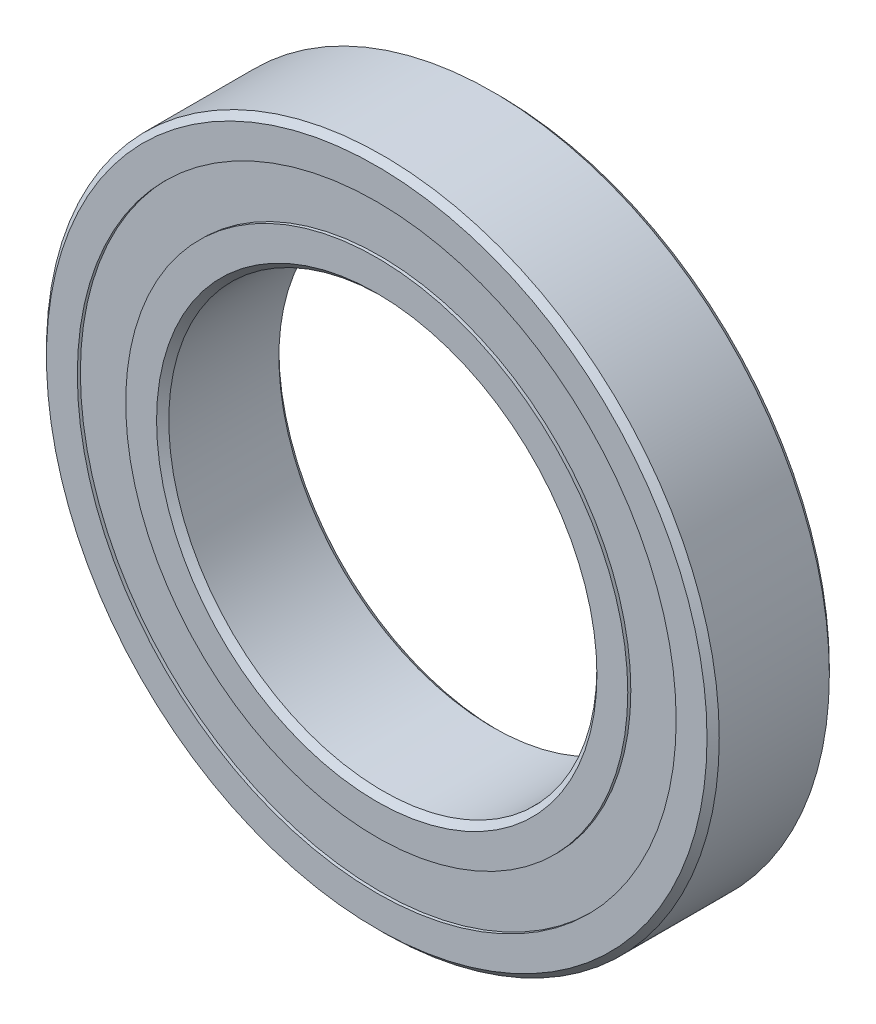
ISO-10303-21;
HEADER;
FILE_DESCRIPTION(('STEP AP214'),'2;1');
FILE_NAME('part.step','',(''),(''),'','','');
FILE_SCHEMA(('AUTOMOTIVE_DESIGN { 1 0 10303 214 1 1 1 1 }'));
ENDSEC;
DATA;
#1=APPLICATION_CONTEXT('core data for automotive mechanical design processes');
#2=APPLICATION_PROTOCOL_DEFINITION('international standard','automotive_design',2000,#1);
#3=PRODUCT_CONTEXT('',#1,'mechanical');
#4=PRODUCT('Part','Part','',(#3));
#5=PRODUCT_RELATED_PRODUCT_CATEGORY('part','',(#4));
#6=PRODUCT_DEFINITION_FORMATION('','',#4);
#7=PRODUCT_DEFINITION_CONTEXT('part definition',#1,'design');
#8=PRODUCT_DEFINITION('design','',#6,#7);
#9=PRODUCT_DEFINITION_SHAPE('','',#8);
#10=(LENGTH_UNIT() NAMED_UNIT(*) SI_UNIT(.MILLI.,.METRE.));
#11=(NAMED_UNIT(*) PLANE_ANGLE_UNIT() SI_UNIT($,.RADIAN.));
#12=(NAMED_UNIT(*) SI_UNIT($,.STERADIAN.) SOLID_ANGLE_UNIT());
#13=UNCERTAINTY_MEASURE_WITH_UNIT(LENGTH_MEASURE(1.E-05),#10,'distance_accuracy_value','');
#14=(GEOMETRIC_REPRESENTATION_CONTEXT(3) GLOBAL_UNCERTAINTY_ASSIGNED_CONTEXT((#13)) GLOBAL_UNIT_ASSIGNED_CONTEXT((#10,
#11,#12)) REPRESENTATION_CONTEXT('',''));
#15=CARTESIAN_POINT('',(0.,0.,0.));
#16=DIRECTION('',(0.,0.,1.));
#17=DIRECTION('',(1.,0.,0.));
#18=AXIS2_PLACEMENT_3D('',#15,#16,#17);
#19=CARTESIAN_POINT('',(0.,24.477771978022,-4.75000000000001));
#20=DIRECTION('',(0.,0.,1.));
#21=DIRECTION('',(1.,0.,0.));
#22=AXIS2_PLACEMENT_3D('',#19,#20,#21);
#23=PLANE('',#22);
#24=CARTESIAN_POINT('',(0.,0.,-4.75000000000001));
#25=DIRECTION('',(0.,0.,1.));
#26=DIRECTION('',(1.,0.,0.));
#27=AXIS2_PLACEMENT_3D('',#24,#25,#26);
#28=CIRCLE('',#27,24.477771978022);
#29=CARTESIAN_POINT('',(24.477771978022,0.,-4.75000000000001));
#30=VERTEX_POINT('',#29);
#31=EDGE_CURVE('E57',#30,#30,#28,.T.);
#32=ORIENTED_EDGE('',*,*,#31,.F.);
#33=EDGE_LOOP('',(#32));
#34=FACE_BOUND('',#33,.T.);
#35=CARTESIAN_POINT('',(0.,0.,-4.75000000000001));
#36=DIRECTION('',(0.,0.,1.));
#37=DIRECTION('',(1.,0.,0.));
#38=AXIS2_PLACEMENT_3D('',#35,#36,#37);
#39=CIRCLE('',#38,20.521728021978);
#40=CARTESIAN_POINT('',(20.521728021978,0.,-4.75000000000001));
#41=VERTEX_POINT('',#40);
#42=EDGE_CURVE('E11',#41,#41,#39,.T.);
#43=ORIENTED_EDGE('',*,*,#42,.T.);
#44=EDGE_LOOP('',(#43));
#45=FACE_BOUND('',#44,.T.);
#46=ADVANCED_FACE('F43',(#34,#45),#23,.F.);
#47=CARTESIAN_POINT('',(0.,0.,5.));
#48=DIRECTION('',(0.,0.,1.));
#49=DIRECTION('',(1.,0.,0.));
#50=AXIS2_PLACEMENT_3D('',#47,#48,#49);
#51=CYLINDRICAL_SURFACE('',#50,20.521728021978);
#52=ORIENTED_EDGE('',*,*,#42,.F.);
#53=EDGE_LOOP('',(#52));
#54=FACE_BOUND('',#53,.T.);
#55=CARTESIAN_POINT('',(0.,0.,-2.97503656288057));
#56=DIRECTION('',(0.,0.,1.));
#57=DIRECTION('',(1.,0.,0.));
#58=AXIS2_PLACEMENT_3D('',#55,#56,#57);
#59=CIRCLE('',#58,20.521728021978);
#60=CARTESIAN_POINT('',(20.521728021978,0.,-2.97503656288057));
#61=VERTEX_POINT('',#60);
#62=EDGE_CURVE('E49',#61,#61,#59,.T.);
#63=ORIENTED_EDGE('',*,*,#62,.T.);
#64=EDGE_LOOP('',(#63));
#65=FACE_BOUND('',#64,.T.);
#66=ADVANCED_FACE('F66',(#54,#65),#51,.F.);
#67=CARTESIAN_POINT('',(0.,24.477771978022,-2.97503656288057));
#68=DIRECTION('',(0.,0.,-1.));
#69=DIRECTION('',(-1.,0.,0.));
#70=AXIS2_PLACEMENT_3D('',#67,#68,#69);
#71=PLANE('',#70);
#72=ORIENTED_EDGE('',*,*,#62,.F.);
#73=EDGE_LOOP('',(#72));
#74=FACE_BOUND('',#73,.T.);
#75=CARTESIAN_POINT('',(0.,0.,-2.97503656288057));
#76=DIRECTION('',(0.,0.,1.));
#77=DIRECTION('',(1.,0.,0.));
#78=AXIS2_PLACEMENT_3D('',#75,#76,#77);
#79=CIRCLE('',#78,24.477771978022);
#80=CARTESIAN_POINT('',(24.477771978022,0.,-2.97503656288057));
#81=VERTEX_POINT('',#80);
#82=EDGE_CURVE('E53',#81,#81,#79,.T.);
#83=ORIENTED_EDGE('',*,*,#82,.T.);
#84=EDGE_LOOP('',(#83));
#85=FACE_BOUND('',#84,.T.);
#86=ADVANCED_FACE('F70',(#74,#85),#71,.F.);
#87=CARTESIAN_POINT('',(0.,0.,5.));
#88=DIRECTION('',(0.,0.,1.));
#89=DIRECTION('',(1.,0.,0.));
#90=AXIS2_PLACEMENT_3D('',#87,#88,#89);
#91=CYLINDRICAL_SURFACE('',#90,24.477771978022);
#92=ORIENTED_EDGE('',*,*,#82,.F.);
#93=EDGE_LOOP('',(#92));
#94=FACE_BOUND('',#93,.T.);
#95=ORIENTED_EDGE('',*,*,#31,.T.);
#96=EDGE_LOOP('',(#95));
#97=FACE_BOUND('',#96,.T.);
#98=ADVANCED_FACE('F63',(#94,#97),#91,.T.);
#99=CLOSED_SHELL('',(#46,#66,#86,#98));
#100=MANIFOLD_SOLID_BREP('B2',#99);
#101=CARTESIAN_POINT('',(0.,24.477771978022,4.75));
#102=DIRECTION('',(0.,0.,-1.));
#103=DIRECTION('',(-1.,0.,0.));
#104=AXIS2_PLACEMENT_3D('',#101,#102,#103);
#105=PLANE('',#104);
#106=CARTESIAN_POINT('',(0.,0.,4.75));
#107=DIRECTION('',(0.,0.,1.));
#108=DIRECTION('',(1.,0.,0.));
#109=AXIS2_PLACEMENT_3D('',#106,#107,#108);
#110=CIRCLE('',#109,20.521728021978);
#111=CARTESIAN_POINT('',(20.521728021978,0.,4.75));
#112=VERTEX_POINT('',#111);
#113=EDGE_CURVE('E42',#112,#112,#110,.T.);
#114=ORIENTED_EDGE('',*,*,#113,.F.);
#115=EDGE_LOOP('',(#114));
#116=FACE_BOUND('',#115,.T.);
#117=CARTESIAN_POINT('',(0.,0.,4.75000000000001));
#118=DIRECTION('',(0.,0.,1.));
#119=DIRECTION('',(1.,0.,0.));
#120=AXIS2_PLACEMENT_3D('',#117,#118,#119);
#121=CIRCLE('',#120,24.477771978022);
#122=CARTESIAN_POINT('',(24.477771978022,0.,4.75000000000001));
#123=VERTEX_POINT('',#122);
#124=EDGE_CURVE('E124',#123,#123,#121,.T.);
#125=ORIENTED_EDGE('',*,*,#124,.T.);
#126=EDGE_LOOP('',(#125));
#127=FACE_BOUND('',#126,.T.);
#128=ADVANCED_FACE('F110',(#116,#127),#105,.F.);
#129=CARTESIAN_POINT('',(0.,0.,5.));
#130=DIRECTION('',(0.,0.,1.));
#131=DIRECTION('',(1.,0.,0.));
#132=AXIS2_PLACEMENT_3D('',#129,#130,#131);
#133=CYLINDRICAL_SURFACE('',#132,20.521728021978);
#134=CARTESIAN_POINT('',(0.,0.,2.97503656288057));
#135=DIRECTION('',(0.,0.,1.));
#136=DIRECTION('',(1.,0.,0.));
#137=AXIS2_PLACEMENT_3D('',#134,#135,#136);
#138=CIRCLE('',#137,20.521728021978);
#139=CARTESIAN_POINT('',(20.521728021978,0.,2.97503656288057));
#140=VERTEX_POINT('',#139);
#141=EDGE_CURVE('E116',#140,#140,#138,.T.);
#142=ORIENTED_EDGE('',*,*,#141,.F.);
#143=EDGE_LOOP('',(#142));
#144=FACE_BOUND('',#143,.T.);
#145=ORIENTED_EDGE('',*,*,#113,.T.);
#146=EDGE_LOOP('',(#145));
#147=FACE_BOUND('',#146,.T.);
#148=ADVANCED_FACE('F139',(#144,#147),#133,.F.);
#149=CARTESIAN_POINT('',(0.,24.477771978022,2.97503656288057));
#150=DIRECTION('',(0.,0.,1.));
#151=DIRECTION('',(1.,0.,0.));
#152=AXIS2_PLACEMENT_3D('',#149,#150,#151);
#153=PLANE('',#152);
#154=CARTESIAN_POINT('',(0.,0.,2.97503656288057));
#155=DIRECTION('',(0.,0.,1.));
#156=DIRECTION('',(1.,0.,0.));
#157=AXIS2_PLACEMENT_3D('',#154,#155,#156);
#158=CIRCLE('',#157,24.477771978022);
#159=CARTESIAN_POINT('',(24.477771978022,0.,2.97503656288057));
#160=VERTEX_POINT('',#159);
#161=EDGE_CURVE('E120',#160,#160,#158,.T.);
#162=ORIENTED_EDGE('',*,*,#161,.F.);
#163=EDGE_LOOP('',(#162));
#164=FACE_BOUND('',#163,.T.);
#165=ORIENTED_EDGE('',*,*,#141,.T.);
#166=EDGE_LOOP('',(#165));
#167=FACE_BOUND('',#166,.T.);
#168=ADVANCED_FACE('F134',(#164,#167),#153,.F.);
#169=CARTESIAN_POINT('',(0.,0.,5.));
#170=DIRECTION('',(0.,0.,1.));
#171=DIRECTION('',(1.,0.,0.));
#172=AXIS2_PLACEMENT_3D('',#169,#170,#171);
#173=CYLINDRICAL_SURFACE('',#172,24.477771978022);
#174=ORIENTED_EDGE('',*,*,#124,.F.);
#175=EDGE_LOOP('',(#174));
#176=FACE_BOUND('',#175,.T.);
#177=ORIENTED_EDGE('',*,*,#161,.T.);
#178=EDGE_LOOP('',(#177));
#179=FACE_BOUND('',#178,.T.);
#180=ADVANCED_FACE('F131',(#176,#179),#173,.T.);
#181=CLOSED_SHELL('',(#128,#148,#168,#180));
#182=MANIFOLD_SOLID_BREP('B6',#181);
#183=CARTESIAN_POINT('',(-11.2498749999997,19.4853550787991,0.));
#184=DIRECTION('',(0.,0.,1.));
#185=DIRECTION('',(-0.499999999999989,0.866025403784445,0.));
#186=AXIS2_PLACEMENT_3D('',#183,#184,#185);
#187=SPHERICAL_SURFACE('',#186,2.97503656288057);
#188=CARTESIAN_POINT('',(-11.2498749999997,19.4853550787991,2.97503656288057));
#189=VERTEX_POINT('',#188);
#190=VERTEX_LOOP('',#189);
#191=FACE_BOUND('',#190,.T.);
#192=ADVANCED_FACE('F177',(#191),#187,.T.);
#193=CLOSED_SHELL('',(#192));
#194=MANIFOLD_SOLID_BREP('B37',#193);
#195=CARTESIAN_POINT('',(-19.4853550787988,11.2498750000002,0.));
#196=DIRECTION('',(0.,0.,1.));
#197=DIRECTION('',(-0.866025403784433,0.50000000000001,0.));
#198=AXIS2_PLACEMENT_3D('',#195,#196,#197);
#199=SPHERICAL_SURFACE('',#198,2.97503656288057);
#200=CARTESIAN_POINT('',(-19.4853550787988,11.2498750000002,2.97503656288057));
#201=VERTEX_POINT('',#200);
#202=VERTEX_LOOP('',#201);
#203=FACE_BOUND('',#202,.T.);
#204=ADVANCED_FACE('F197',(#203),#199,.T.);
#205=CLOSED_SHELL('',(#204));
#206=MANIFOLD_SOLID_BREP('B106',#205);
#207=CARTESIAN_POINT('',(-22.49975,2.35672371760907E-13,0.));
#208=DIRECTION('',(0.,0.,1.));
#209=DIRECTION('',(-1.,0.,0.));
#210=AXIS2_PLACEMENT_3D('',#207,#208,#209);
#211=SPHERICAL_SURFACE('',#210,2.97503656288057);
#212=CARTESIAN_POINT('',(-22.49975,2.35672371760907E-13,2.97503656288057));
#213=VERTEX_POINT('',#212);
#214=VERTEX_LOOP('',#213);
#215=FACE_BOUND('',#214,.T.);
#216=ADVANCED_FACE('F217',(#215),#211,.T.);
#217=CLOSED_SHELL('',(#216));
#218=MANIFOLD_SOLID_BREP('B173',#217);
#219=CARTESIAN_POINT('',(-19.485355078799,-11.2498749999998,0.));
#220=DIRECTION('',(0.,0.,1.));
#221=DIRECTION('',(-0.866025403784443,-0.499999999999992,0.));
#222=AXIS2_PLACEMENT_3D('',#219,#220,#221);
#223=SPHERICAL_SURFACE('',#222,2.97503656288057);
#224=CARTESIAN_POINT('',(-19.485355078799,-11.2498749999998,2.97503656288057));
#225=VERTEX_POINT('',#224);
#226=VERTEX_LOOP('',#225);
#227=FACE_BOUND('',#226,.T.);
#228=ADVANCED_FACE('F237',(#227),#223,.T.);
#229=CLOSED_SHELL('',(#228));
#230=MANIFOLD_SOLID_BREP('B193',#229);
#231=CARTESIAN_POINT('',(-11.2498750000002,-19.4853550787988,0.));
#232=DIRECTION('',(0.,0.,1.));
#233=DIRECTION('',(-0.500000000000007,-0.866025403784435,0.));
#234=AXIS2_PLACEMENT_3D('',#231,#232,#233);
#235=SPHERICAL_SURFACE('',#234,2.97503656288057);
#236=CARTESIAN_POINT('',(-11.2498750000002,-19.4853550787988,2.97503656288057));
#237=VERTEX_POINT('',#236);
#238=VERTEX_LOOP('',#237);
#239=FACE_BOUND('',#238,.T.);
#240=ADVANCED_FACE('F257',(#239),#235,.T.);
#241=CLOSED_SHELL('',(#240));
#242=MANIFOLD_SOLID_BREP('B213',#241);
#243=CARTESIAN_POINT('',(-1.57114914507272E-13,-22.49975,0.));
#244=DIRECTION('',(0.,0.,1.));
#245=DIRECTION('',(0.,-1.,0.));
#246=AXIS2_PLACEMENT_3D('',#243,#244,#245);
#247=SPHERICAL_SURFACE('',#246,2.97503656288057);
#248=CARTESIAN_POINT('',(-1.57114914507272E-13,-22.49975,2.97503656288057));
#249=VERTEX_POINT('',#248);
#250=VERTEX_LOOP('',#249);
#251=FACE_BOUND('',#250,.T.);
#252=ADVANCED_FACE('F277',(#251),#247,.T.);
#253=CLOSED_SHELL('',(#252));
#254=MANIFOLD_SOLID_BREP('B233',#253);
#255=CARTESIAN_POINT('',(11.2498749999999,-19.485355078799,0.));
#256=DIRECTION('',(0.,0.,1.));
#257=DIRECTION('',(0.499999999999995,-0.866025403784442,0.));
#258=AXIS2_PLACEMENT_3D('',#255,#256,#257);
#259=SPHERICAL_SURFACE('',#258,2.97503656288057);
#260=CARTESIAN_POINT('',(11.2498749999999,-19.485355078799,2.97503656288057));
#261=VERTEX_POINT('',#260);
#262=VERTEX_LOOP('',#261);
#263=FACE_BOUND('',#262,.T.);
#264=ADVANCED_FACE('F297',(#263),#259,.T.);
#265=CLOSED_SHELL('',(#264));
#266=MANIFOLD_SOLID_BREP('B253',#265);
#267=CARTESIAN_POINT('',(19.4853550787989,-11.2498750000001,0.));
#268=DIRECTION('',(0.,0.,1.));
#269=DIRECTION('',(0.866025403784436,-0.500000000000004,0.));
#270=AXIS2_PLACEMENT_3D('',#267,#268,#269);
#271=SPHERICAL_SURFACE('',#270,2.97503656288057);
#272=CARTESIAN_POINT('',(19.4853550787989,-11.2498750000001,2.97503656288057));
#273=VERTEX_POINT('',#272);
#274=VERTEX_LOOP('',#273);
#275=FACE_BOUND('',#274,.T.);
#276=ADVANCED_FACE('F317',(#275),#271,.T.);
#277=CLOSED_SHELL('',(#276));
#278=MANIFOLD_SOLID_BREP('B273',#277);
#279=CARTESIAN_POINT('',(22.49975,0.,0.));
#280=DIRECTION('',(0.,0.,1.));
#281=DIRECTION('',(1.,0.,0.));
#282=AXIS2_PLACEMENT_3D('',#279,#280,#281);
#283=SPHERICAL_SURFACE('',#282,2.97503656288057);
#284=CARTESIAN_POINT('',(22.49975,0.,2.97503656288057));
#285=VERTEX_POINT('',#284);
#286=VERTEX_LOOP('',#285);
#287=FACE_BOUND('',#286,.T.);
#288=ADVANCED_FACE('F337',(#287),#283,.T.);
#289=CLOSED_SHELL('',(#288));
#290=MANIFOLD_SOLID_BREP('B293',#289);
#291=CARTESIAN_POINT('',(19.4853550787989,11.249875,0.));
#292=DIRECTION('',(0.,0.,1.));
#293=DIRECTION('',(0.86602540378444,0.499999999999998,0.));
#294=AXIS2_PLACEMENT_3D('',#291,#292,#293);
#295=SPHERICAL_SURFACE('',#294,2.97503656288057);
#296=CARTESIAN_POINT('',(19.4853550787989,11.249875,2.97503656288057));
#297=VERTEX_POINT('',#296);
#298=VERTEX_LOOP('',#297);
#299=FACE_BOUND('',#298,.T.);
#300=ADVANCED_FACE('F357',(#299),#295,.T.);
#301=CLOSED_SHELL('',(#300));
#302=MANIFOLD_SOLID_BREP('B313',#301);
#303=CARTESIAN_POINT('',(11.249875,19.4853550787989,0.));
#304=DIRECTION('',(0.,0.,1.));
#305=DIRECTION('',(0.500000000000001,0.866025403784438,0.));
#306=AXIS2_PLACEMENT_3D('',#303,#304,#305);
#307=SPHERICAL_SURFACE('',#306,2.97503656288057);
#308=CARTESIAN_POINT('',(11.249875,19.4853550787989,2.97503656288057));
#309=VERTEX_POINT('',#308);
#310=VERTEX_LOOP('',#309);
#311=FACE_BOUND('',#310,.T.);
#312=ADVANCED_FACE('F377',(#311),#307,.T.);
#313=CLOSED_SHELL('',(#312));
#314=MANIFOLD_SOLID_BREP('B333',#313);
#315=CARTESIAN_POINT('',(0.,22.49975,0.));
#316=DIRECTION('',(0.,0.,1.));
#317=DIRECTION('',(0.,1.,0.));
#318=AXIS2_PLACEMENT_3D('',#315,#316,#317);
#319=SPHERICAL_SURFACE('',#318,2.97503656288057);
#320=CARTESIAN_POINT('',(0.,22.49975,2.97503656288057));
#321=VERTEX_POINT('',#320);
#322=VERTEX_LOOP('',#321);
#323=FACE_BOUND('',#322,.T.);
#324=ADVANCED_FACE('F399',(#323),#319,.T.);
#325=CLOSED_SHELL('',(#324));
#326=MANIFOLD_SOLID_BREP('B353',#325);
#327=CARTESIAN_POINT('',(0.,20.521728021978,5.));
#328=DIRECTION('',(0.,0.,-1.));
#329=DIRECTION('',(-1.,0.,0.));
#330=AXIS2_PLACEMENT_3D('',#327,#328,#329);
#331=PLANE('',#330);
#332=CARTESIAN_POINT('',(0.,0.,5.));
#333=DIRECTION('',(0.,0.,1.));
#334=DIRECTION('',(1.,0.,0.));
#335=AXIS2_PLACEMENT_3D('',#332,#333,#334);
#336=CIRCLE('',#335,17.9995);
#337=CARTESIAN_POINT('',(17.9995,0.,5.));
#338=VERTEX_POINT('',#337);
#339=EDGE_CURVE('E446',#338,#338,#336,.T.);
#340=ORIENTED_EDGE('',*,*,#339,.F.);
#341=EDGE_LOOP('',(#340));
#342=FACE_BOUND('',#341,.T.);
#343=CARTESIAN_POINT('',(0.,0.,5.));
#344=DIRECTION('',(0.,0.,1.));
#345=DIRECTION('',(1.,0.,0.));
#346=AXIS2_PLACEMENT_3D('',#343,#344,#345);
#347=CIRCLE('',#346,20.521728021978);
#348=CARTESIAN_POINT('',(20.521728021978,0.,5.));
#349=VERTEX_POINT('',#348);
#350=EDGE_CURVE('E398',#349,#349,#347,.T.);
#351=ORIENTED_EDGE('',*,*,#350,.T.);
#352=EDGE_LOOP('',(#351));
#353=FACE_BOUND('',#352,.T.);
#354=ADVANCED_FACE('F418',(#342,#353),#331,.F.);
#355=CARTESIAN_POINT('',(0.,0.,5.));
#356=DIRECTION('',(0.,0.,1.));
#357=DIRECTION('',(1.,0.,0.));
#358=AXIS2_PLACEMENT_3D('',#355,#356,#357);
#359=CYLINDRICAL_SURFACE('',#358,20.521728021978);
#360=ORIENTED_EDGE('',*,*,#350,.F.);
#361=EDGE_LOOP('',(#360));
#362=FACE_BOUND('',#361,.T.);
#363=CARTESIAN_POINT('',(0.,0.,2.22222222222222));
#364=DIRECTION('',(0.,0.,1.));
#365=DIRECTION('',(1.,0.,0.));
#366=AXIS2_PLACEMENT_3D('',#363,#364,#365);
#367=CIRCLE('',#366,20.521728021978);
#368=CARTESIAN_POINT('',(20.521728021978,0.,2.22222222222222));
#369=VERTEX_POINT('',#368);
#370=EDGE_CURVE('E424',#369,#369,#367,.T.);
#371=ORIENTED_EDGE('',*,*,#370,.T.);
#372=EDGE_LOOP('',(#371));
#373=FACE_BOUND('',#372,.T.);
#374=ADVANCED_FACE('F453',(#362,#373),#359,.T.);
#375=CARTESIAN_POINT('',(0.,0.,0.));
#376=DIRECTION('',(0.,0.,1.));
#377=DIRECTION('',(1.,0.,0.));
#378=AXIS2_PLACEMENT_3D('',#375,#376,#377);
#379=TOROIDAL_SURFACE('',#378,22.49975,2.97503656288057);
#380=ORIENTED_EDGE('',*,*,#370,.F.);
#381=EDGE_LOOP('',(#380));
#382=FACE_BOUND('',#381,.T.);
#383=CARTESIAN_POINT('',(0.,0.,-2.22222222222223));
#384=DIRECTION('',(0.,0.,1.));
#385=DIRECTION('',(1.,0.,0.));
#386=AXIS2_PLACEMENT_3D('',#383,#384,#385);
#387=CIRCLE('',#386,20.521728021978);
#388=CARTESIAN_POINT('',(20.521728021978,0.,-2.22222222222223));
#389=VERTEX_POINT('',#388);
#390=EDGE_CURVE('E428',#389,#389,#387,.T.);
#391=ORIENTED_EDGE('',*,*,#390,.T.);
#392=EDGE_LOOP('',(#391));
#393=FACE_BOUND('',#392,.T.);
#394=ADVANCED_FACE('F457',(#382,#393),#379,.F.);
#395=CARTESIAN_POINT('',(0.,0.,5.));
#396=DIRECTION('',(0.,0.,1.));
#397=DIRECTION('',(1.,0.,0.));
#398=AXIS2_PLACEMENT_3D('',#395,#396,#397);
#399=CYLINDRICAL_SURFACE('',#398,20.521728021978);
#400=ORIENTED_EDGE('',*,*,#390,.F.);
#401=EDGE_LOOP('',(#400));
#402=FACE_BOUND('',#401,.T.);
#403=CARTESIAN_POINT('',(0.,0.,-5.00000000000001));
#404=DIRECTION('',(0.,0.,1.));
#405=DIRECTION('',(1.,0.,0.));
#406=AXIS2_PLACEMENT_3D('',#403,#404,#405);
#407=CIRCLE('',#406,20.521728021978);
#408=CARTESIAN_POINT('',(20.521728021978,0.,-5.00000000000001));
#409=VERTEX_POINT('',#408);
#410=EDGE_CURVE('E432',#409,#409,#407,.T.);
#411=ORIENTED_EDGE('',*,*,#410,.T.);
#412=EDGE_LOOP('',(#411));
#413=FACE_BOUND('',#412,.T.);
#414=ADVANCED_FACE('F462',(#402,#413),#399,.T.);
#415=CARTESIAN_POINT('',(0.,17.9995,-5.));
#416=DIRECTION('',(0.,0.,1.));
#417=DIRECTION('',(1.,0.,0.));
#418=AXIS2_PLACEMENT_3D('',#415,#416,#417);
#419=PLANE('',#418);
#420=ORIENTED_EDGE('',*,*,#410,.F.);
#421=EDGE_LOOP('',(#420));
#422=FACE_BOUND('',#421,.T.);
#423=CARTESIAN_POINT('',(0.,0.,-5.00000000000001));
#424=DIRECTION('',(0.,0.,1.));
#425=DIRECTION('',(1.,0.,0.));
#426=AXIS2_PLACEMENT_3D('',#423,#424,#425);
#427=CIRCLE('',#426,17.9995);
#428=CARTESIAN_POINT('',(17.9995,0.,-5.00000000000001));
#429=VERTEX_POINT('',#428);
#430=EDGE_CURVE('E437',#429,#429,#427,.T.);
#431=ORIENTED_EDGE('',*,*,#430,.T.);
#432=EDGE_LOOP('',(#431));
#433=FACE_BOUND('',#432,.T.);
#434=ADVANCED_FACE('F468',(#422,#433),#419,.F.);
#435=CARTESIAN_POINT('',(0.,0.,-4.5));
#436=DIRECTION('',(0.,0.,-1.));
#437=DIRECTION('',(-1.,0.,0.));
#438=AXIS2_PLACEMENT_3D('',#435,#436,#437);
#439=CONICAL_SURFACE('',#438,17.4995,0.785398163397445);
#440=ORIENTED_EDGE('',*,*,#430,.F.);
#441=EDGE_LOOP('',(#440));
#442=FACE_BOUND('',#441,.T.);
#443=CARTESIAN_POINT('',(0.,0.,-4.5));
#444=DIRECTION('',(0.,0.,1.));
#445=DIRECTION('',(1.,0.,0.));
#446=AXIS2_PLACEMENT_3D('',#443,#444,#445);
#447=CIRCLE('',#446,17.4995);
#448=CARTESIAN_POINT('',(17.4995,0.,-4.5));
#449=VERTEX_POINT('',#448);
#450=EDGE_CURVE('E440',#449,#449,#447,.T.);
#451=ORIENTED_EDGE('',*,*,#450,.T.);
#452=EDGE_LOOP('',(#451));
#453=FACE_BOUND('',#452,.T.);
#454=ADVANCED_FACE('F472',(#442,#453),#439,.F.);
#455=CARTESIAN_POINT('',(0.,0.,5.));
#456=DIRECTION('',(0.,0.,1.));
#457=DIRECTION('',(1.,0.,0.));
#458=AXIS2_PLACEMENT_3D('',#455,#456,#457);
#459=CYLINDRICAL_SURFACE('',#458,17.4995);
#460=ORIENTED_EDGE('',*,*,#450,.F.);
#461=EDGE_LOOP('',(#460));
#462=FACE_BOUND('',#461,.T.);
#463=CARTESIAN_POINT('',(0.,0.,4.50000000000001));
#464=DIRECTION('',(0.,0.,1.));
#465=DIRECTION('',(1.,0.,0.));
#466=AXIS2_PLACEMENT_3D('',#463,#464,#465);
#467=CIRCLE('',#466,17.4995);
#468=CARTESIAN_POINT('',(17.4995,0.,4.50000000000001));
#469=VERTEX_POINT('',#468);
#470=EDGE_CURVE('E443',#469,#469,#467,.T.);
#471=ORIENTED_EDGE('',*,*,#470,.T.);
#472=EDGE_LOOP('',(#471));
#473=FACE_BOUND('',#472,.T.);
#474=ADVANCED_FACE('F476',(#462,#473),#459,.F.);
#475=CARTESIAN_POINT('',(0.,0.,5.));
#476=DIRECTION('',(0.,0.,1.));
#477=DIRECTION('',(1.,0.,0.));
#478=AXIS2_PLACEMENT_3D('',#475,#476,#477);
#479=CONICAL_SURFACE('',#478,17.9995,0.785398163397452);
#480=ORIENTED_EDGE('',*,*,#470,.F.);
#481=EDGE_LOOP('',(#480));
#482=FACE_BOUND('',#481,.T.);
#483=ORIENTED_EDGE('',*,*,#339,.T.);
#484=EDGE_LOOP('',(#483));
#485=FACE_BOUND('',#484,.T.);
#486=ADVANCED_FACE('F450',(#482,#485),#479,.F.);
#487=CLOSED_SHELL('',(#354,#374,#394,#414,#434,#454,#474,#486));
#488=MANIFOLD_SOLID_BREP('B373',#487);
#489=CARTESIAN_POINT('',(0.,0.,4.5));
#490=DIRECTION('',(0.,0.,-1.));
#491=DIRECTION('',(-1.,0.,0.));
#492=AXIS2_PLACEMENT_3D('',#489,#490,#491);
#493=CONICAL_SURFACE('',#492,27.5,0.785398163397446);
#494=CARTESIAN_POINT('',(0.,0.,5.));
#495=DIRECTION('',(0.,0.,1.));
#496=DIRECTION('',(1.,0.,0.));
#497=AXIS2_PLACEMENT_3D('',#494,#495,#496);
#498=CIRCLE('',#497,27.);
#499=CARTESIAN_POINT('',(27.,0.,5.));
#500=VERTEX_POINT('',#499);
#501=EDGE_CURVE('E567',#500,#500,#498,.T.);
#502=ORIENTED_EDGE('',*,*,#501,.F.);
#503=EDGE_LOOP('',(#502));
#504=FACE_BOUND('',#503,.T.);
#505=CARTESIAN_POINT('',(0.,0.,4.5));
#506=DIRECTION('',(0.,0.,1.));
#507=DIRECTION('',(1.,0.,0.));
#508=AXIS2_PLACEMENT_3D('',#505,#506,#507);
#509=CIRCLE('',#508,27.5);
#510=CARTESIAN_POINT('',(27.5,0.,4.5));
#511=VERTEX_POINT('',#510);
#512=EDGE_CURVE('E417',#511,#511,#509,.T.);
#513=ORIENTED_EDGE('',*,*,#512,.T.);
#514=EDGE_LOOP('',(#513));
#515=FACE_BOUND('',#514,.T.);
#516=ADVANCED_FACE('F539',(#504,#515),#493,.T.);
#517=CARTESIAN_POINT('',(0.,0.,5.));
#518=DIRECTION('',(0.,0.,1.));
#519=DIRECTION('',(1.,0.,0.));
#520=AXIS2_PLACEMENT_3D('',#517,#518,#519);
#521=CYLINDRICAL_SURFACE('',#520,27.5);
#522=ORIENTED_EDGE('',*,*,#512,.F.);
#523=EDGE_LOOP('',(#522));
#524=FACE_BOUND('',#523,.T.);
#525=CARTESIAN_POINT('',(0.,0.,-4.5));
#526=DIRECTION('',(0.,0.,1.));
#527=DIRECTION('',(1.,0.,0.));
#528=AXIS2_PLACEMENT_3D('',#525,#526,#527);
#529=CIRCLE('',#528,27.5);
#530=CARTESIAN_POINT('',(27.5,0.,-4.5));
#531=VERTEX_POINT('',#530);
#532=EDGE_CURVE('E545',#531,#531,#529,.T.);
#533=ORIENTED_EDGE('',*,*,#532,.T.);
#534=EDGE_LOOP('',(#533));
#535=FACE_BOUND('',#534,.T.);
#536=ADVANCED_FACE('F574',(#524,#535),#521,.T.);
#537=CARTESIAN_POINT('',(0.,0.,-5.00000000000001));
#538=DIRECTION('',(0.,0.,1.));
#539=DIRECTION('',(1.,0.,0.));
#540=AXIS2_PLACEMENT_3D('',#537,#538,#539);
#541=CONICAL_SURFACE('',#540,27.,0.785398163397445);
#542=ORIENTED_EDGE('',*,*,#532,.F.);
#543=EDGE_LOOP('',(#542));
#544=FACE_BOUND('',#543,.T.);
#545=CARTESIAN_POINT('',(0.,0.,-5.00000000000001));
#546=DIRECTION('',(0.,0.,1.));
#547=DIRECTION('',(1.,0.,0.));
#548=AXIS2_PLACEMENT_3D('',#545,#546,#547);
#549=CIRCLE('',#548,27.);
#550=CARTESIAN_POINT('',(27.,0.,-5.00000000000001));
#551=VERTEX_POINT('',#550);
#552=EDGE_CURVE('E549',#551,#551,#549,.T.);
#553=ORIENTED_EDGE('',*,*,#552,.T.);
#554=EDGE_LOOP('',(#553));
#555=FACE_BOUND('',#554,.T.);
#556=ADVANCED_FACE('F578',(#544,#555),#541,.T.);
#557=CARTESIAN_POINT('',(0.,27.,-5.));
#558=DIRECTION('',(0.,0.,1.));
#559=DIRECTION('',(1.,0.,0.));
#560=AXIS2_PLACEMENT_3D('',#557,#558,#559);
#561=PLANE('',#560);
#562=ORIENTED_EDGE('',*,*,#552,.F.);
#563=EDGE_LOOP('',(#562));
#564=FACE_BOUND('',#563,.T.);
#565=CARTESIAN_POINT('',(0.,0.,-5.00000000000001));
#566=DIRECTION('',(0.,0.,1.));
#567=DIRECTION('',(1.,0.,0.));
#568=AXIS2_PLACEMENT_3D('',#565,#566,#567);
#569=CIRCLE('',#568,24.477771978022);
#570=CARTESIAN_POINT('',(24.477771978022,0.,-5.00000000000001));
#571=VERTEX_POINT('',#570);
#572=EDGE_CURVE('E553',#571,#571,#569,.T.);
#573=ORIENTED_EDGE('',*,*,#572,.T.);
#574=EDGE_LOOP('',(#573));
#575=FACE_BOUND('',#574,.T.);
#576=ADVANCED_FACE('F583',(#564,#575),#561,.F.);
#577=CARTESIAN_POINT('',(0.,0.,5.));
#578=DIRECTION('',(0.,0.,1.));
#579=DIRECTION('',(1.,0.,0.));
#580=AXIS2_PLACEMENT_3D('',#577,#578,#579);
#581=CYLINDRICAL_SURFACE('',#580,24.477771978022);
#582=ORIENTED_EDGE('',*,*,#572,.F.);
#583=EDGE_LOOP('',(#582));
#584=FACE_BOUND('',#583,.T.);
#585=CARTESIAN_POINT('',(0.,0.,-2.22222222222222));
#586=DIRECTION('',(0.,0.,1.));
#587=DIRECTION('',(1.,0.,0.));
#588=AXIS2_PLACEMENT_3D('',#585,#586,#587);
#589=CIRCLE('',#588,24.477771978022);
#590=CARTESIAN_POINT('',(24.477771978022,0.,-2.22222222222222));
#591=VERTEX_POINT('',#590);
#592=EDGE_CURVE('E558',#591,#591,#589,.T.);
#593=ORIENTED_EDGE('',*,*,#592,.T.);
#594=EDGE_LOOP('',(#593));
#595=FACE_BOUND('',#594,.T.);
#596=ADVANCED_FACE('F589',(#584,#595),#581,.F.);
#597=CARTESIAN_POINT('',(0.,0.,0.));
#598=DIRECTION('',(0.,0.,1.));
#599=DIRECTION('',(1.,0.,0.));
#600=AXIS2_PLACEMENT_3D('',#597,#598,#599);
#601=TOROIDAL_SURFACE('',#600,22.49975,2.97503656288057);
#602=ORIENTED_EDGE('',*,*,#592,.F.);
#603=EDGE_LOOP('',(#602));
#604=FACE_BOUND('',#603,.T.);
#605=CARTESIAN_POINT('',(0.,0.,2.22222222222222));
#606=DIRECTION('',(0.,0.,1.));
#607=DIRECTION('',(1.,0.,0.));
#608=AXIS2_PLACEMENT_3D('',#605,#606,#607);
#609=CIRCLE('',#608,24.477771978022);
#610=CARTESIAN_POINT('',(24.477771978022,0.,2.22222222222222));
#611=VERTEX_POINT('',#610);
#612=EDGE_CURVE('E561',#611,#611,#609,.T.);
#613=ORIENTED_EDGE('',*,*,#612,.T.);
#614=EDGE_LOOP('',(#613));
#615=FACE_BOUND('',#614,.T.);
#616=ADVANCED_FACE('F593',(#604,#615),#601,.F.);
#617=CARTESIAN_POINT('',(0.,0.,5.));
#618=DIRECTION('',(0.,0.,1.));
#619=DIRECTION('',(1.,0.,0.));
#620=AXIS2_PLACEMENT_3D('',#617,#618,#619);
#621=CYLINDRICAL_SURFACE('',#620,24.477771978022);
#622=ORIENTED_EDGE('',*,*,#612,.F.);
#623=EDGE_LOOP('',(#622));
#624=FACE_BOUND('',#623,.T.);
#625=CARTESIAN_POINT('',(0.,0.,5.));
#626=DIRECTION('',(0.,0.,1.));
#627=DIRECTION('',(1.,0.,0.));
#628=AXIS2_PLACEMENT_3D('',#625,#626,#627);
#629=CIRCLE('',#628,24.477771978022);
#630=CARTESIAN_POINT('',(24.477771978022,0.,5.));
#631=VERTEX_POINT('',#630);
#632=EDGE_CURVE('E564',#631,#631,#629,.T.);
#633=ORIENTED_EDGE('',*,*,#632,.T.);
#634=EDGE_LOOP('',(#633));
#635=FACE_BOUND('',#634,.T.);
#636=ADVANCED_FACE('F597',(#624,#635),#621,.F.);
#637=CARTESIAN_POINT('',(0.,27.,5.));
#638=DIRECTION('',(0.,0.,-1.));
#639=DIRECTION('',(-1.,0.,0.));
#640=AXIS2_PLACEMENT_3D('',#637,#638,#639);
#641=PLANE('',#640);
#642=ORIENTED_EDGE('',*,*,#632,.F.);
#643=EDGE_LOOP('',(#642));
#644=FACE_BOUND('',#643,.T.);
#645=ORIENTED_EDGE('',*,*,#501,.T.);
#646=EDGE_LOOP('',(#645));
#647=FACE_BOUND('',#646,.T.);
#648=ADVANCED_FACE('F571',(#644,#647),#641,.F.);
#649=CLOSED_SHELL('',(#516,#536,#556,#576,#596,#616,#636,#648));
#650=MANIFOLD_SOLID_BREP('B393',#649);
#651=ADVANCED_BREP_SHAPE_REPRESENTATION('',(#18,#100,#182,#194,#206,#218,#230,#242,#254,#266,
#278,#290,#302,#314,#326,#488,#650),#14);
#652=SHAPE_DEFINITION_REPRESENTATION(#9,#651);
ENDSEC;
END-ISO-10303-21;
